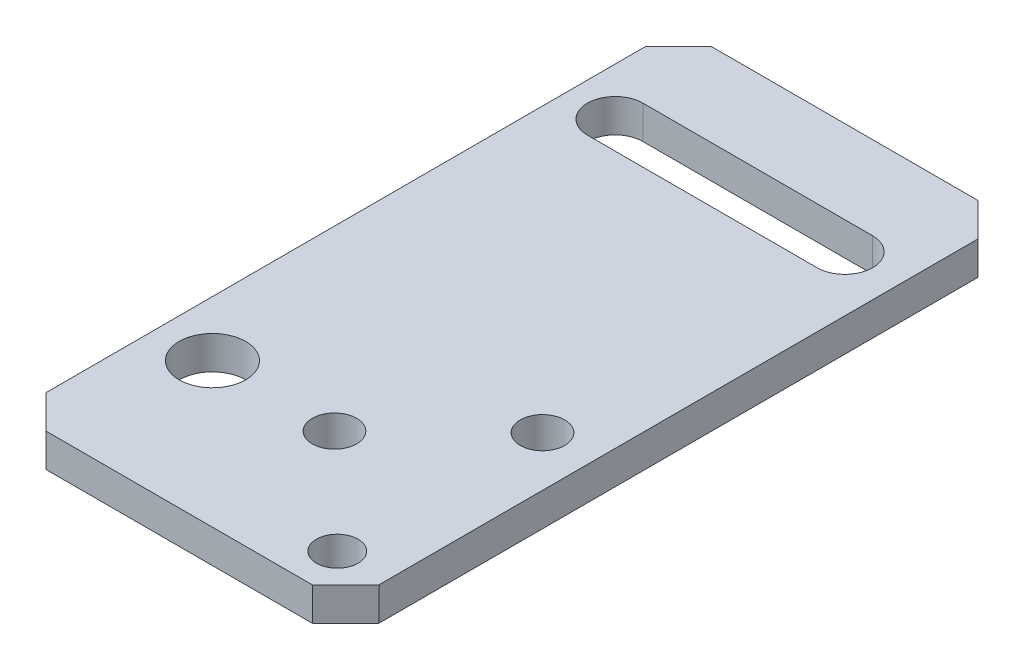
ISO-10303-21;
HEADER;
FILE_DESCRIPTION(('STEP AP214'),'2;1');
FILE_NAME('part.step','',(''),(''),'','','');
FILE_SCHEMA(('AUTOMOTIVE_DESIGN { 1 0 10303 214 1 1 1 1 }'));
ENDSEC;
DATA;
#1=APPLICATION_CONTEXT('core data for automotive mechanical design processes');
#2=APPLICATION_PROTOCOL_DEFINITION('international standard','automotive_design',2000,#1);
#3=PRODUCT_CONTEXT('',#1,'mechanical');
#4=PRODUCT('Part','Part','',(#3));
#5=PRODUCT_RELATED_PRODUCT_CATEGORY('part','',(#4));
#6=PRODUCT_DEFINITION_FORMATION('','',#4);
#7=PRODUCT_DEFINITION_CONTEXT('part definition',#1,'design');
#8=PRODUCT_DEFINITION('design','',#6,#7);
#9=PRODUCT_DEFINITION_SHAPE('','',#8);
#10=(LENGTH_UNIT() NAMED_UNIT(*) SI_UNIT(.MILLI.,.METRE.));
#11=(NAMED_UNIT(*) PLANE_ANGLE_UNIT() SI_UNIT($,.RADIAN.));
#12=(NAMED_UNIT(*) SI_UNIT($,.STERADIAN.) SOLID_ANGLE_UNIT());
#13=UNCERTAINTY_MEASURE_WITH_UNIT(LENGTH_MEASURE(1.E-05),#10,'distance_accuracy_value','');
#14=(GEOMETRIC_REPRESENTATION_CONTEXT(3) GLOBAL_UNCERTAINTY_ASSIGNED_CONTEXT((#13)) GLOBAL_UNIT_ASSIGNED_CONTEXT((#10,
#11,#12)) REPRESENTATION_CONTEXT('',''));
#15=CARTESIAN_POINT('',(0.,0.,0.));
#16=DIRECTION('',(0.,0.,1.));
#17=DIRECTION('',(1.,0.,0.));
#18=AXIS2_PLACEMENT_3D('',#15,#16,#17);
#19=CARTESIAN_POINT('',(0.,3.,0.));
#20=DIRECTION('',(0.,-1.,0.));
#21=DIRECTION('',(0.,0.,-1.));
#22=AXIS2_PLACEMENT_3D('',#19,#20,#21);
#23=PLANE('',#22);
#24=CARTESIAN_POINT('',(10.5,3.,26.25));
#25=DIRECTION('',(0.,1.,0.));
#26=DIRECTION('',(0.,0.,1.));
#27=AXIS2_PLACEMENT_3D('',#24,#25,#26);
#28=CIRCLE('',#27,1.87844521491594);
#29=CARTESIAN_POINT('',(10.5,3.,28.1284452149159));
#30=VERTEX_POINT('',#29);
#31=EDGE_CURVE('E192',#30,#30,#28,.T.);
#32=ORIENTED_EDGE('',*,*,#31,.F.);
#33=EDGE_LOOP('',(#32));
#34=FACE_BOUND('',#33,.T.);
#35=CARTESIAN_POINT('',(10.5,3.,7.74999999999999));
#36=DIRECTION('',(0.,1.,0.));
#37=DIRECTION('',(0.,0.,1.));
#38=AXIS2_PLACEMENT_3D('',#35,#36,#37);
#39=CIRCLE('',#38,2.00000000000001);
#40=CARTESIAN_POINT('',(10.5,3.,9.75));
#41=VERTEX_POINT('',#40);
#42=EDGE_CURVE('E200',#41,#41,#39,.T.);
#43=ORIENTED_EDGE('',*,*,#42,.F.);
#44=EDGE_LOOP('',(#43));
#45=FACE_BOUND('',#44,.T.);
#46=CARTESIAN_POINT('',(1.,3.,17.));
#47=DIRECTION('',(0.,1.,0.));
#48=DIRECTION('',(0.,0.,1.));
#49=AXIS2_PLACEMENT_3D('',#46,#47,#48);
#50=CIRCLE('',#49,2.00000000000002);
#51=CARTESIAN_POINT('',(1.,3.,19.));
#52=VERTEX_POINT('',#51);
#53=EDGE_CURVE('E208',#52,#52,#50,.T.);
#54=ORIENTED_EDGE('',*,*,#53,.F.);
#55=EDGE_LOOP('',(#54));
#56=FACE_BOUND('',#55,.T.);
#57=CARTESIAN_POINT('',(-10.,3.,17.));
#58=DIRECTION('',(0.,1.,0.));
#59=DIRECTION('',(0.,0.,1.));
#60=AXIS2_PLACEMENT_3D('',#57,#58,#59);
#61=CIRCLE('',#60,3.00000000000001);
#62=CARTESIAN_POINT('',(-10.,3.,20.));
#63=VERTEX_POINT('',#62);
#64=EDGE_CURVE('E216',#63,#63,#61,.T.);
#65=ORIENTED_EDGE('',*,*,#64,.F.);
#66=EDGE_LOOP('',(#65));
#67=FACE_BOUND('',#66,.T.);
#68=DIRECTION('',(1.,0.,0.));
#69=VECTOR('',#68,1.);
#70=CARTESIAN_POINT('',(-15.,3.,30.));
#71=LINE('',#70,#69);
#72=CARTESIAN_POINT('',(-12.,3.,30.));
#73=VERTEX_POINT('',#72);
#74=CARTESIAN_POINT('',(12.,3.,30.));
#75=VERTEX_POINT('',#74);
#76=EDGE_CURVE('E235',#73,#75,#71,.T.);
#77=ORIENTED_EDGE('',*,*,#76,.T.);
#78=DIRECTION('',(-0.707106781186548,0.,0.707106781186547));
#79=VECTOR('',#78,1.);
#80=CARTESIAN_POINT('',(15.,3.,27.));
#81=LINE('',#80,#79);
#82=CARTESIAN_POINT('',(15.,3.,27.));
#83=VERTEX_POINT('',#82);
#84=EDGE_CURVE('E286',#75,#83,#81,.F.);
#85=ORIENTED_EDGE('',*,*,#84,.T.);
#86=DIRECTION('',(0.,0.,-1.));
#87=VECTOR('',#86,1.);
#88=CARTESIAN_POINT('',(15.,3.,30.));
#89=LINE('',#88,#87);
#90=CARTESIAN_POINT('',(15.,3.,-27.));
#91=VERTEX_POINT('',#90);
#92=EDGE_CURVE('E224',#83,#91,#89,.T.);
#93=ORIENTED_EDGE('',*,*,#92,.T.);
#94=DIRECTION('',(0.707106781186547,0.,0.707106781186548));
#95=VECTOR('',#94,1.);
#96=CARTESIAN_POINT('',(12.,3.,-30.));
#97=LINE('',#96,#95);
#98=CARTESIAN_POINT('',(12.,3.,-30.));
#99=VERTEX_POINT('',#98);
#100=EDGE_CURVE('E280',#91,#99,#97,.F.);
#101=ORIENTED_EDGE('',*,*,#100,.T.);
#102=DIRECTION('',(-1.,0.,0.));
#103=VECTOR('',#102,1.);
#104=CARTESIAN_POINT('',(-15.,3.,-30.));
#105=LINE('',#104,#103);
#106=CARTESIAN_POINT('',(-12.,3.,-30.));
#107=VERTEX_POINT('',#106);
#108=EDGE_CURVE('E228',#99,#107,#105,.T.);
#109=ORIENTED_EDGE('',*,*,#108,.T.);
#110=DIRECTION('',(0.707106781186549,0.,-0.707106781186546));
#111=VECTOR('',#110,1.);
#112=CARTESIAN_POINT('',(-15.,3.,-27.));
#113=LINE('',#112,#111);
#114=CARTESIAN_POINT('',(-15.,3.,-27.));
#115=VERTEX_POINT('',#114);
#116=EDGE_CURVE('E69',#107,#115,#113,.F.);
#117=ORIENTED_EDGE('',*,*,#116,.T.);
#118=DIRECTION('',(0.,0.,1.));
#119=VECTOR('',#118,1.);
#120=CARTESIAN_POINT('',(-15.,3.,30.));
#121=LINE('',#120,#119);
#122=CARTESIAN_POINT('',(-15.,3.,27.));
#123=VERTEX_POINT('',#122);
#124=EDGE_CURVE('E232',#115,#123,#121,.T.);
#125=ORIENTED_EDGE('',*,*,#124,.T.);
#126=DIRECTION('',(-0.707106781186547,0.,-0.707106781186548));
#127=VECTOR('',#126,1.);
#128=CARTESIAN_POINT('',(-12.,3.,30.));
#129=LINE('',#128,#127);
#130=EDGE_CURVE('E283',#123,#73,#129,.F.);
#131=ORIENTED_EDGE('',*,*,#130,.T.);
#132=EDGE_LOOP('',(#77,#85,#93,#101,#109,#117,#125,#131));
#133=FACE_BOUND('',#132,.T.);
#134=CARTESIAN_POINT('',(-10.7,3.,-20.));
#135=DIRECTION('',(0.,1.,0.));
#136=DIRECTION('',(0.,0.,1.));
#137=AXIS2_PLACEMENT_3D('',#134,#135,#136);
#138=CIRCLE('',#137,2.5);
#139=CARTESIAN_POINT('',(-10.7,3.,-22.5));
#140=VERTEX_POINT('',#139);
#141=CARTESIAN_POINT('',(-10.7,3.,-17.5));
#142=VERTEX_POINT('',#141);
#143=EDGE_CURVE('E139',#140,#142,#138,.T.);
#144=ORIENTED_EDGE('',*,*,#143,.F.);
#145=DIRECTION('',(-1.,0.,0.));
#146=VECTOR('',#145,1.);
#147=CARTESIAN_POINT('',(-10.7,3.,-22.5));
#148=LINE('',#147,#146);
#149=CARTESIAN_POINT('',(10.,3.,-22.5));
#150=VERTEX_POINT('',#149);
#151=EDGE_CURVE('E168',#150,#140,#148,.T.);
#152=ORIENTED_EDGE('',*,*,#151,.F.);
#153=CARTESIAN_POINT('',(10.,3.,-20.));
#154=DIRECTION('',(0.,1.,0.));
#155=DIRECTION('',(0.,0.,1.));
#156=AXIS2_PLACEMENT_3D('',#153,#154,#155);
#157=CIRCLE('',#156,2.5);
#158=CARTESIAN_POINT('',(10.,3.,-17.5));
#159=VERTEX_POINT('',#158);
#160=EDGE_CURVE('E164',#159,#150,#157,.T.);
#161=ORIENTED_EDGE('',*,*,#160,.F.);
#162=DIRECTION('',(1.,0.,0.));
#163=VECTOR('',#162,1.);
#164=CARTESIAN_POINT('',(-10.7,3.,-17.5));
#165=LINE('',#164,#163);
#166=EDGE_CURVE('E150',#142,#159,#165,.T.);
#167=ORIENTED_EDGE('',*,*,#166,.F.);
#168=EDGE_LOOP('',(#144,#152,#161,#167));
#169=FACE_BOUND('',#168,.T.);
#170=ADVANCED_FACE('F45',(#34,#45,#56,#67,#133,#169),#23,.F.);
#171=CARTESIAN_POINT('',(0.,0.,0.));
#172=DIRECTION('',(0.,-1.,0.));
#173=DIRECTION('',(0.,0.,-1.));
#174=AXIS2_PLACEMENT_3D('',#171,#172,#173);
#175=PLANE('',#174);
#176=CARTESIAN_POINT('',(10.5,0.,7.74999999999999));
#177=DIRECTION('',(0.,1.,0.));
#178=DIRECTION('',(0.,0.,1.));
#179=AXIS2_PLACEMENT_3D('',#176,#177,#178);
#180=CIRCLE('',#179,2.00000000000001);
#181=CARTESIAN_POINT('',(10.5,0.,9.75));
#182=VERTEX_POINT('',#181);
#183=EDGE_CURVE('E196',#182,#182,#180,.T.);
#184=ORIENTED_EDGE('',*,*,#183,.T.);
#185=EDGE_LOOP('',(#184));
#186=FACE_BOUND('',#185,.T.);
#187=CARTESIAN_POINT('',(-10.,0.,17.));
#188=DIRECTION('',(0.,1.,0.));
#189=DIRECTION('',(0.,0.,1.));
#190=AXIS2_PLACEMENT_3D('',#187,#188,#189);
#191=CIRCLE('',#190,3.00000000000001);
#192=CARTESIAN_POINT('',(-10.,0.,20.));
#193=VERTEX_POINT('',#192);
#194=EDGE_CURVE('E212',#193,#193,#191,.T.);
#195=ORIENTED_EDGE('',*,*,#194,.T.);
#196=EDGE_LOOP('',(#195));
#197=FACE_BOUND('',#196,.T.);
#198=DIRECTION('',(0.,0.,-1.));
#199=VECTOR('',#198,1.);
#200=CARTESIAN_POINT('',(15.,0.,30.));
#201=LINE('',#200,#199);
#202=CARTESIAN_POINT('',(15.,0.,27.));
#203=VERTEX_POINT('',#202);
#204=CARTESIAN_POINT('',(15.,0.,-27.));
#205=VERTEX_POINT('',#204);
#206=EDGE_CURVE('E220',#203,#205,#201,.T.);
#207=ORIENTED_EDGE('',*,*,#206,.F.);
#208=DIRECTION('',(0.707106781186548,0.,-0.707106781186547));
#209=VECTOR('',#208,1.);
#210=CARTESIAN_POINT('',(21.,0.,21.));
#211=LINE('',#210,#209);
#212=CARTESIAN_POINT('',(12.,0.,30.));
#213=VERTEX_POINT('',#212);
#214=EDGE_CURVE('E268',#203,#213,#211,.F.);
#215=ORIENTED_EDGE('',*,*,#214,.T.);
#216=DIRECTION('',(1.,0.,0.));
#217=VECTOR('',#216,1.);
#218=CARTESIAN_POINT('',(-15.,0.,30.));
#219=LINE('',#218,#217);
#220=CARTESIAN_POINT('',(-12.,0.,30.));
#221=VERTEX_POINT('',#220);
#222=EDGE_CURVE('E229',#221,#213,#219,.T.);
#223=ORIENTED_EDGE('',*,*,#222,.F.);
#224=DIRECTION('',(0.707106781186547,0.,0.707106781186548));
#225=VECTOR('',#224,1.);
#226=CARTESIAN_POINT('',(-21.,0.,21.));
#227=LINE('',#226,#225);
#228=CARTESIAN_POINT('',(-15.,0.,27.));
#229=VERTEX_POINT('',#228);
#230=EDGE_CURVE('E265',#221,#229,#227,.F.);
#231=ORIENTED_EDGE('',*,*,#230,.T.);
#232=DIRECTION('',(0.,0.,1.));
#233=VECTOR('',#232,1.);
#234=CARTESIAN_POINT('',(-15.,0.,30.));
#235=LINE('',#234,#233);
#236=CARTESIAN_POINT('',(-15.,0.,-27.));
#237=VERTEX_POINT('',#236);
#238=EDGE_CURVE('E247',#237,#229,#235,.T.);
#239=ORIENTED_EDGE('',*,*,#238,.F.);
#240=DIRECTION('',(-0.707106781186549,0.,0.707106781186546));
#241=VECTOR('',#240,1.);
#242=CARTESIAN_POINT('',(-21.,0.,-21.0000000000001));
#243=LINE('',#242,#241);
#244=CARTESIAN_POINT('',(-12.,0.,-30.));
#245=VERTEX_POINT('',#244);
#246=EDGE_CURVE('E259',#237,#245,#243,.F.);
#247=ORIENTED_EDGE('',*,*,#246,.T.);
#248=DIRECTION('',(-1.,0.,0.));
#249=VECTOR('',#248,1.);
#250=CARTESIAN_POINT('',(-15.,0.,-30.));
#251=LINE('',#250,#249);
#252=CARTESIAN_POINT('',(12.,0.,-30.));
#253=VERTEX_POINT('',#252);
#254=EDGE_CURVE('E243',#253,#245,#251,.T.);
#255=ORIENTED_EDGE('',*,*,#254,.F.);
#256=DIRECTION('',(-0.707106781186547,0.,-0.707106781186548));
#257=VECTOR('',#256,1.);
#258=CARTESIAN_POINT('',(21.,0.,-21.));
#259=LINE('',#258,#257);
#260=EDGE_CURVE('E262',#253,#205,#259,.F.);
#261=ORIENTED_EDGE('',*,*,#260,.T.);
#262=EDGE_LOOP('',(#207,#215,#223,#231,#239,#247,#255,#261));
#263=FACE_BOUND('',#262,.T.);
#264=CARTESIAN_POINT('',(1.,0.,17.));
#265=DIRECTION('',(0.,1.,0.));
#266=DIRECTION('',(0.,0.,1.));
#267=AXIS2_PLACEMENT_3D('',#264,#265,#266);
#268=CIRCLE('',#267,2.00000000000002);
#269=CARTESIAN_POINT('',(1.,0.,19.));
#270=VERTEX_POINT('',#269);
#271=EDGE_CURVE('E204',#270,#270,#268,.T.);
#272=ORIENTED_EDGE('',*,*,#271,.T.);
#273=EDGE_LOOP('',(#272));
#274=FACE_BOUND('',#273,.T.);
#275=CARTESIAN_POINT('',(10.5,0.,26.25));
#276=DIRECTION('',(0.,1.,0.));
#277=DIRECTION('',(0.,0.,1.));
#278=AXIS2_PLACEMENT_3D('',#275,#276,#277);
#279=CIRCLE('',#278,1.87844521491594);
#280=CARTESIAN_POINT('',(10.5,0.,28.1284452149159));
#281=VERTEX_POINT('',#280);
#282=EDGE_CURVE('E159',#281,#281,#279,.T.);
#283=ORIENTED_EDGE('',*,*,#282,.T.);
#284=EDGE_LOOP('',(#283));
#285=FACE_BOUND('',#284,.T.);
#286=DIRECTION('',(-1.,0.,0.));
#287=VECTOR('',#286,1.);
#288=CARTESIAN_POINT('',(-10.7,0.,-22.5));
#289=LINE('',#288,#287);
#290=CARTESIAN_POINT('',(10.,0.,-22.5));
#291=VERTEX_POINT('',#290);
#292=CARTESIAN_POINT('',(-10.7,0.,-22.5));
#293=VERTEX_POINT('',#292);
#294=EDGE_CURVE('E151',#291,#293,#289,.T.);
#295=ORIENTED_EDGE('',*,*,#294,.T.);
#296=CARTESIAN_POINT('',(-10.7,0.,-20.));
#297=DIRECTION('',(0.,1.,0.));
#298=DIRECTION('',(0.,0.,1.));
#299=AXIS2_PLACEMENT_3D('',#296,#297,#298);
#300=CIRCLE('',#299,2.5);
#301=CARTESIAN_POINT('',(-10.7,0.,-17.5));
#302=VERTEX_POINT('',#301);
#303=EDGE_CURVE('E173',#293,#302,#300,.T.);
#304=ORIENTED_EDGE('',*,*,#303,.T.);
#305=DIRECTION('',(1.,0.,0.));
#306=VECTOR('',#305,1.);
#307=CARTESIAN_POINT('',(-10.7,0.,-17.5));
#308=LINE('',#307,#306);
#309=CARTESIAN_POINT('',(10.,0.,-17.5));
#310=VERTEX_POINT('',#309);
#311=EDGE_CURVE('E157',#302,#310,#308,.T.);
#312=ORIENTED_EDGE('',*,*,#311,.T.);
#313=CARTESIAN_POINT('',(10.,0.,-20.));
#314=DIRECTION('',(0.,1.,0.));
#315=DIRECTION('',(0.,0.,1.));
#316=AXIS2_PLACEMENT_3D('',#313,#314,#315);
#317=CIRCLE('',#316,2.5);
#318=EDGE_CURVE('E178',#310,#291,#317,.T.);
#319=ORIENTED_EDGE('',*,*,#318,.T.);
#320=EDGE_LOOP('',(#295,#304,#312,#319));
#321=FACE_BOUND('',#320,.T.);
#322=ADVANCED_FACE('F308',(#186,#197,#263,#274,#285,#321),#175,.T.);
#323=CARTESIAN_POINT('',(15.,3.,30.));
#324=DIRECTION('',(-1.,0.,0.));
#325=DIRECTION('',(0.,0.,1.));
#326=AXIS2_PLACEMENT_3D('',#323,#324,#325);
#327=PLANE('',#326);
#328=ORIENTED_EDGE('',*,*,#92,.F.);
#329=DIRECTION('',(0.,-1.,0.));
#330=VECTOR('',#329,1.);
#331=CARTESIAN_POINT('',(15.,3.,27.));
#332=LINE('',#331,#330);
#333=EDGE_CURVE('E255',#83,#203,#332,.T.);
#334=ORIENTED_EDGE('',*,*,#333,.T.);
#335=ORIENTED_EDGE('',*,*,#206,.T.);
#336=DIRECTION('',(0.,1.,0.));
#337=VECTOR('',#336,1.);
#338=CARTESIAN_POINT('',(15.,3.,-27.));
#339=LINE('',#338,#337);
#340=EDGE_CURVE('E239',#205,#91,#339,.T.);
#341=ORIENTED_EDGE('',*,*,#340,.T.);
#342=EDGE_LOOP('',(#328,#334,#335,#341));
#343=FACE_BOUND('',#342,.T.);
#344=ADVANCED_FACE('F325',(#343),#327,.F.);
#345=CARTESIAN_POINT('',(-15.,3.,-30.));
#346=DIRECTION('',(0.,0.,1.));
#347=DIRECTION('',(1.,0.,0.));
#348=AXIS2_PLACEMENT_3D('',#345,#346,#347);
#349=PLANE('',#348);
#350=ORIENTED_EDGE('',*,*,#108,.F.);
#351=DIRECTION('',(0.,-1.,0.));
#352=VECTOR('',#351,1.);
#353=CARTESIAN_POINT('',(12.,3.,-30.));
#354=LINE('',#353,#352);
#355=EDGE_CURVE('E11',#99,#253,#354,.T.);
#356=ORIENTED_EDGE('',*,*,#355,.T.);
#357=ORIENTED_EDGE('',*,*,#254,.T.);
#358=DIRECTION('',(0.,1.,0.));
#359=VECTOR('',#358,1.);
#360=CARTESIAN_POINT('',(-12.,3.,-30.));
#361=LINE('',#360,#359);
#362=EDGE_CURVE('E55',#245,#107,#361,.T.);
#363=ORIENTED_EDGE('',*,*,#362,.T.);
#364=EDGE_LOOP('',(#350,#356,#357,#363));
#365=FACE_BOUND('',#364,.T.);
#366=ADVANCED_FACE('F298',(#365),#349,.F.);
#367=CARTESIAN_POINT('',(-15.,3.,30.));
#368=DIRECTION('',(1.,0.,0.));
#369=DIRECTION('',(0.,0.,-1.));
#370=AXIS2_PLACEMENT_3D('',#367,#368,#369);
#371=PLANE('',#370);
#372=ORIENTED_EDGE('',*,*,#238,.T.);
#373=DIRECTION('',(0.,1.,0.));
#374=VECTOR('',#373,1.);
#375=CARTESIAN_POINT('',(-15.,3.,27.));
#376=LINE('',#375,#374);
#377=EDGE_CURVE('E62',#229,#123,#376,.T.);
#378=ORIENTED_EDGE('',*,*,#377,.T.);
#379=ORIENTED_EDGE('',*,*,#124,.F.);
#380=DIRECTION('',(0.,-1.,0.));
#381=VECTOR('',#380,1.);
#382=CARTESIAN_POINT('',(-15.,3.,-27.));
#383=LINE('',#382,#381);
#384=EDGE_CURVE('E289',#115,#237,#383,.T.);
#385=ORIENTED_EDGE('',*,*,#384,.T.);
#386=EDGE_LOOP('',(#372,#378,#379,#385));
#387=FACE_BOUND('',#386,.T.);
#388=ADVANCED_FACE('F305',(#387),#371,.F.);
#389=CARTESIAN_POINT('',(-15.,3.,30.));
#390=DIRECTION('',(0.,0.,-1.));
#391=DIRECTION('',(-1.,0.,0.));
#392=AXIS2_PLACEMENT_3D('',#389,#390,#391);
#393=PLANE('',#392);
#394=ORIENTED_EDGE('',*,*,#222,.T.);
#395=DIRECTION('',(0.,1.,0.));
#396=VECTOR('',#395,1.);
#397=CARTESIAN_POINT('',(12.,3.,30.));
#398=LINE('',#397,#396);
#399=EDGE_CURVE('E275',#213,#75,#398,.T.);
#400=ORIENTED_EDGE('',*,*,#399,.T.);
#401=ORIENTED_EDGE('',*,*,#76,.F.);
#402=DIRECTION('',(0.,-1.,0.));
#403=VECTOR('',#402,1.);
#404=CARTESIAN_POINT('',(-12.,3.,30.));
#405=LINE('',#404,#403);
#406=EDGE_CURVE('E271',#73,#221,#405,.T.);
#407=ORIENTED_EDGE('',*,*,#406,.T.);
#408=EDGE_LOOP('',(#394,#400,#401,#407));
#409=FACE_BOUND('',#408,.T.);
#410=ADVANCED_FACE('F317',(#409),#393,.F.);
#411=CARTESIAN_POINT('',(-10.,3.,17.));
#412=DIRECTION('',(0.,-1.,0.));
#413=DIRECTION('',(0.,0.,-1.));
#414=AXIS2_PLACEMENT_3D('',#411,#412,#413);
#415=CYLINDRICAL_SURFACE('',#414,3.00000000000001);
#416=ORIENTED_EDGE('',*,*,#64,.T.);
#417=EDGE_LOOP('',(#416));
#418=FACE_BOUND('',#417,.T.);
#419=ORIENTED_EDGE('',*,*,#194,.F.);
#420=EDGE_LOOP('',(#419));
#421=FACE_BOUND('',#420,.T.);
#422=ADVANCED_FACE('F347',(#418,#421),#415,.F.);
#423=CARTESIAN_POINT('',(1.,3.,17.));
#424=DIRECTION('',(0.,-1.,0.));
#425=DIRECTION('',(0.,0.,-1.));
#426=AXIS2_PLACEMENT_3D('',#423,#424,#425);
#427=CYLINDRICAL_SURFACE('',#426,2.00000000000002);
#428=ORIENTED_EDGE('',*,*,#53,.T.);
#429=EDGE_LOOP('',(#428));
#430=FACE_BOUND('',#429,.T.);
#431=ORIENTED_EDGE('',*,*,#271,.F.);
#432=EDGE_LOOP('',(#431));
#433=FACE_BOUND('',#432,.T.);
#434=ADVANCED_FACE('F393',(#430,#433),#427,.F.);
#435=CARTESIAN_POINT('',(10.5,3.,7.74999999999999));
#436=DIRECTION('',(0.,-1.,0.));
#437=DIRECTION('',(0.,0.,-1.));
#438=AXIS2_PLACEMENT_3D('',#435,#436,#437);
#439=CYLINDRICAL_SURFACE('',#438,2.00000000000001);
#440=ORIENTED_EDGE('',*,*,#42,.T.);
#441=EDGE_LOOP('',(#440));
#442=FACE_BOUND('',#441,.T.);
#443=ORIENTED_EDGE('',*,*,#183,.F.);
#444=EDGE_LOOP('',(#443));
#445=FACE_BOUND('',#444,.T.);
#446=ADVANCED_FACE('F390',(#442,#445),#439,.F.);
#447=CARTESIAN_POINT('',(10.5,3.,26.25));
#448=DIRECTION('',(0.,-1.,0.));
#449=DIRECTION('',(0.,0.,-1.));
#450=AXIS2_PLACEMENT_3D('',#447,#448,#449);
#451=CYLINDRICAL_SURFACE('',#450,1.87844521491594);
#452=ORIENTED_EDGE('',*,*,#31,.T.);
#453=EDGE_LOOP('',(#452));
#454=FACE_BOUND('',#453,.T.);
#455=ORIENTED_EDGE('',*,*,#282,.F.);
#456=EDGE_LOOP('',(#455));
#457=FACE_BOUND('',#456,.T.);
#458=ADVANCED_FACE('F387',(#454,#457),#451,.F.);
#459=CARTESIAN_POINT('',(-10.7,3.,-20.));
#460=DIRECTION('',(0.,-1.,0.));
#461=DIRECTION('',(0.,0.,-1.));
#462=AXIS2_PLACEMENT_3D('',#459,#460,#461);
#463=CYLINDRICAL_SURFACE('',#462,2.5);
#464=ORIENTED_EDGE('',*,*,#303,.F.);
#465=DIRECTION('',(0.,-1.,0.));
#466=VECTOR('',#465,1.);
#467=CARTESIAN_POINT('',(-10.7,3.,-22.5));
#468=LINE('',#467,#466);
#469=EDGE_CURVE('E145',#140,#293,#468,.T.);
#470=ORIENTED_EDGE('',*,*,#469,.F.);
#471=ORIENTED_EDGE('',*,*,#143,.T.);
#472=DIRECTION('',(0.,-1.,0.));
#473=VECTOR('',#472,1.);
#474=CARTESIAN_POINT('',(-10.7,3.,-17.5));
#475=LINE('',#474,#473);
#476=EDGE_CURVE('E142',#142,#302,#475,.T.);
#477=ORIENTED_EDGE('',*,*,#476,.T.);
#478=EDGE_LOOP('',(#464,#470,#471,#477));
#479=FACE_BOUND('',#478,.T.);
#480=ADVANCED_FACE('F141',(#479),#463,.F.);
#481=CARTESIAN_POINT('',(-10.7,3.,-17.5));
#482=DIRECTION('',(0.,0.,-1.));
#483=DIRECTION('',(-1.,0.,0.));
#484=AXIS2_PLACEMENT_3D('',#481,#482,#483);
#485=PLANE('',#484);
#486=ORIENTED_EDGE('',*,*,#311,.F.);
#487=ORIENTED_EDGE('',*,*,#476,.F.);
#488=ORIENTED_EDGE('',*,*,#166,.T.);
#489=DIRECTION('',(0.,-1.,0.));
#490=VECTOR('',#489,1.);
#491=CARTESIAN_POINT('',(10.,3.,-17.5));
#492=LINE('',#491,#490);
#493=EDGE_CURVE('E160',#159,#310,#492,.T.);
#494=ORIENTED_EDGE('',*,*,#493,.T.);
#495=EDGE_LOOP('',(#486,#487,#488,#494));
#496=FACE_BOUND('',#495,.T.);
#497=ADVANCED_FACE('F154',(#496),#485,.T.);
#498=CARTESIAN_POINT('',(10.,3.,-20.));
#499=DIRECTION('',(0.,-1.,0.));
#500=DIRECTION('',(0.,0.,-1.));
#501=AXIS2_PLACEMENT_3D('',#498,#499,#500);
#502=CYLINDRICAL_SURFACE('',#501,2.5);
#503=ORIENTED_EDGE('',*,*,#318,.F.);
#504=ORIENTED_EDGE('',*,*,#493,.F.);
#505=ORIENTED_EDGE('',*,*,#160,.T.);
#506=DIRECTION('',(0.,-1.,0.));
#507=VECTOR('',#506,1.);
#508=CARTESIAN_POINT('',(10.,3.,-22.5));
#509=LINE('',#508,#507);
#510=EDGE_CURVE('E187',#150,#291,#509,.T.);
#511=ORIENTED_EDGE('',*,*,#510,.T.);
#512=EDGE_LOOP('',(#503,#504,#505,#511));
#513=FACE_BOUND('',#512,.T.);
#514=ADVANCED_FACE('F373',(#513),#502,.F.);
#515=CARTESIAN_POINT('',(-10.7,3.,-22.5));
#516=DIRECTION('',(0.,0.,1.));
#517=DIRECTION('',(1.,0.,0.));
#518=AXIS2_PLACEMENT_3D('',#515,#516,#517);
#519=PLANE('',#518);
#520=ORIENTED_EDGE('',*,*,#294,.F.);
#521=ORIENTED_EDGE('',*,*,#510,.F.);
#522=ORIENTED_EDGE('',*,*,#151,.T.);
#523=ORIENTED_EDGE('',*,*,#469,.T.);
#524=EDGE_LOOP('',(#520,#521,#522,#523));
#525=FACE_BOUND('',#524,.T.);
#526=ADVANCED_FACE('F363',(#525),#519,.T.);
#527=CARTESIAN_POINT('',(15.,3.,27.));
#528=DIRECTION('',(-0.707106781186547,0.,-0.707106781186548));
#529=DIRECTION('',(0.,-1.,0.));
#530=AXIS2_PLACEMENT_3D('',#527,#528,#529);
#531=PLANE('',#530);
#532=ORIENTED_EDGE('',*,*,#84,.F.);
#533=ORIENTED_EDGE('',*,*,#399,.F.);
#534=ORIENTED_EDGE('',*,*,#214,.F.);
#535=ORIENTED_EDGE('',*,*,#333,.F.);
#536=EDGE_LOOP('',(#532,#533,#534,#535));
#537=FACE_BOUND('',#536,.T.);
#538=ADVANCED_FACE('F323',(#537),#531,.F.);
#539=CARTESIAN_POINT('',(-12.,3.,30.));
#540=DIRECTION('',(0.707106781186548,0.,-0.707106781186547));
#541=DIRECTION('',(0.,-1.,0.));
#542=AXIS2_PLACEMENT_3D('',#539,#540,#541);
#543=PLANE('',#542);
#544=ORIENTED_EDGE('',*,*,#130,.F.);
#545=ORIENTED_EDGE('',*,*,#377,.F.);
#546=ORIENTED_EDGE('',*,*,#230,.F.);
#547=ORIENTED_EDGE('',*,*,#406,.F.);
#548=EDGE_LOOP('',(#544,#545,#546,#547));
#549=FACE_BOUND('',#548,.T.);
#550=ADVANCED_FACE('F314',(#549),#543,.F.);
#551=CARTESIAN_POINT('',(12.,3.,-30.));
#552=DIRECTION('',(-0.707106781186548,0.,0.707106781186547));
#553=DIRECTION('',(0.,-1.,0.));
#554=AXIS2_PLACEMENT_3D('',#551,#552,#553);
#555=PLANE('',#554);
#556=ORIENTED_EDGE('',*,*,#100,.F.);
#557=ORIENTED_EDGE('',*,*,#340,.F.);
#558=ORIENTED_EDGE('',*,*,#260,.F.);
#559=ORIENTED_EDGE('',*,*,#355,.F.);
#560=EDGE_LOOP('',(#556,#557,#558,#559));
#561=FACE_BOUND('',#560,.T.);
#562=ADVANCED_FACE('F328',(#561),#555,.F.);
#563=CARTESIAN_POINT('',(-15.,3.,-27.));
#564=DIRECTION('',(0.707106781186546,0.,0.707106781186549));
#565=DIRECTION('',(0.,-1.,0.));
#566=AXIS2_PLACEMENT_3D('',#563,#564,#565);
#567=PLANE('',#566);
#568=ORIENTED_EDGE('',*,*,#116,.F.);
#569=ORIENTED_EDGE('',*,*,#362,.F.);
#570=ORIENTED_EDGE('',*,*,#246,.F.);
#571=ORIENTED_EDGE('',*,*,#384,.F.);
#572=EDGE_LOOP('',(#568,#569,#570,#571));
#573=FACE_BOUND('',#572,.T.);
#574=ADVANCED_FACE('F48',(#573),#567,.F.);
#575=CLOSED_SHELL('',(#170,#322,#344,#366,#388,#410,#422,#434,#446,#458,#480,#497,#514,#526,
#538,#550,#562,#574));
#576=MANIFOLD_SOLID_BREP('B2',#575);
#577=ADVANCED_BREP_SHAPE_REPRESENTATION('',(#18,#576),#14);
#578=SHAPE_DEFINITION_REPRESENTATION(#9,#577);
ENDSEC;
END-ISO-10303-21;
